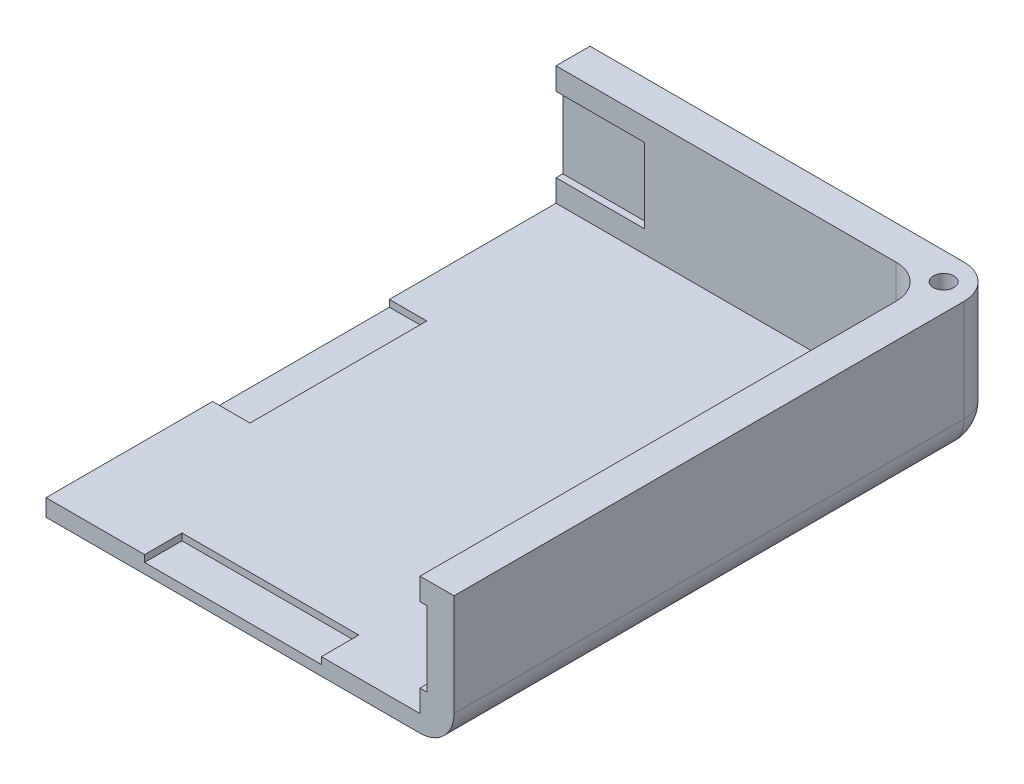
ISO-10303-21;
HEADER;
FILE_DESCRIPTION(('STEP AP214'),'2;1');
FILE_NAME('part.step','',(''),(''),'','','');
FILE_SCHEMA(('AUTOMOTIVE_DESIGN { 1 0 10303 214 1 1 1 1 }'));
ENDSEC;
DATA;
#1=APPLICATION_CONTEXT('core data for automotive mechanical design processes');
#2=APPLICATION_PROTOCOL_DEFINITION('international standard','automotive_design',2000,#1);
#3=PRODUCT_CONTEXT('',#1,'mechanical');
#4=PRODUCT('Part','Part','',(#3));
#5=PRODUCT_RELATED_PRODUCT_CATEGORY('part','',(#4));
#6=PRODUCT_DEFINITION_FORMATION('','',#4);
#7=PRODUCT_DEFINITION_CONTEXT('part definition',#1,'design');
#8=PRODUCT_DEFINITION('design','',#6,#7);
#9=PRODUCT_DEFINITION_SHAPE('','',#8);
#10=(LENGTH_UNIT() NAMED_UNIT(*) SI_UNIT(.MILLI.,.METRE.));
#11=(NAMED_UNIT(*) PLANE_ANGLE_UNIT() SI_UNIT($,.RADIAN.));
#12=(NAMED_UNIT(*) SI_UNIT($,.STERADIAN.) SOLID_ANGLE_UNIT());
#13=UNCERTAINTY_MEASURE_WITH_UNIT(LENGTH_MEASURE(1.E-05),#10,'distance_accuracy_value','');
#14=(GEOMETRIC_REPRESENTATION_CONTEXT(3) GLOBAL_UNCERTAINTY_ASSIGNED_CONTEXT((#13)) GLOBAL_UNIT_ASSIGNED_CONTEXT((#10,
#11,#12)) REPRESENTATION_CONTEXT('',''));
#15=CARTESIAN_POINT('',(0.,0.,0.));
#16=DIRECTION('',(0.,0.,1.));
#17=DIRECTION('',(1.,0.,0.));
#18=AXIS2_PLACEMENT_3D('',#15,#16,#17);
#19=CARTESIAN_POINT('',(0.,40.,0.));
#20=DIRECTION('',(1.,0.,0.));
#21=DIRECTION('',(0.,0.,-1.));
#22=AXIS2_PLACEMENT_3D('',#19,#20,#21);
#23=PLANE('',#22);
#24=DIRECTION('',(0.,-1.,0.));
#25=VECTOR('',#24,1.);
#26=CARTESIAN_POINT('',(0.,33.5,-152.));
#27=LINE('',#26,#25);
#28=CARTESIAN_POINT('',(0.,33.5,-152.));
#29=VERTEX_POINT('',#28);
#30=CARTESIAN_POINT('',(0.,11.5,-152.));
#31=VERTEX_POINT('',#30);
#32=EDGE_CURVE('E239',#29,#31,#27,.T.);
#33=ORIENTED_EDGE('',*,*,#32,.F.);
#34=DIRECTION('',(0.,0.,1.));
#35=VECTOR('',#34,1.);
#36=CARTESIAN_POINT('',(0.,33.5,-152.));
#37=LINE('',#36,#35);
#38=CARTESIAN_POINT('',(0.,33.5,-150.));
#39=VERTEX_POINT('',#38);
#40=EDGE_CURVE('E259',#29,#39,#37,.T.);
#41=ORIENTED_EDGE('',*,*,#40,.T.);
#42=DIRECTION('',(0.,1.,0.));
#43=VECTOR('',#42,1.);
#44=CARTESIAN_POINT('',(0.,5.,-150.));
#45=LINE('',#44,#43);
#46=CARTESIAN_POINT('',(0.,40.,-150.));
#47=VERTEX_POINT('',#46);
#48=EDGE_CURVE('E357',#39,#47,#45,.T.);
#49=ORIENTED_EDGE('',*,*,#48,.T.);
#50=DIRECTION('',(0.,0.,1.));
#51=VECTOR('',#50,1.);
#52=CARTESIAN_POINT('',(0.,40.,0.));
#53=LINE('',#52,#51);
#54=CARTESIAN_POINT('',(0.,40.,-160.));
#55=VERTEX_POINT('',#54);
#56=EDGE_CURVE('E361',#55,#47,#53,.T.);
#57=ORIENTED_EDGE('',*,*,#56,.F.);
#58=DIRECTION('',(0.,-1.,0.));
#59=VECTOR('',#58,1.);
#60=CARTESIAN_POINT('',(0.,40.,-160.));
#61=LINE('',#60,#59);
#62=CARTESIAN_POINT('',(0.,10.,-160.));
#63=VERTEX_POINT('',#62);
#64=EDGE_CURVE('E372',#55,#63,#61,.T.);
#65=ORIENTED_EDGE('',*,*,#64,.T.);
#66=CARTESIAN_POINT('',(0.,10.,-150.));
#67=DIRECTION('',(1.,0.,0.));
#68=DIRECTION('',(0.,0.,-1.));
#69=AXIS2_PLACEMENT_3D('',#66,#67,#68);
#70=CIRCLE('',#69,10.);
#71=CARTESIAN_POINT('',(0.,0.,-150.));
#72=VERTEX_POINT('',#71);
#73=EDGE_CURVE('E388',#63,#72,#70,.F.);
#74=ORIENTED_EDGE('',*,*,#73,.T.);
#75=DIRECTION('',(0.,0.,1.));
#76=VECTOR('',#75,1.);
#77=CARTESIAN_POINT('',(0.,0.,0.));
#78=LINE('',#77,#76);
#79=CARTESIAN_POINT('',(0.,0.,0.));
#80=VERTEX_POINT('',#79);
#81=EDGE_CURVE('E373',#72,#80,#78,.T.);
#82=ORIENTED_EDGE('',*,*,#81,.T.);
#83=DIRECTION('',(0.,-1.,0.));
#84=VECTOR('',#83,1.);
#85=CARTESIAN_POINT('',(0.,40.,0.));
#86=LINE('',#85,#84);
#87=CARTESIAN_POINT('',(0.,5.,0.));
#88=VERTEX_POINT('',#87);
#89=EDGE_CURVE('E384',#88,#80,#86,.T.);
#90=ORIENTED_EDGE('',*,*,#89,.F.);
#91=DIRECTION('',(0.,0.,1.));
#92=VECTOR('',#91,1.);
#93=CARTESIAN_POINT('',(0.,5.,0.));
#94=LINE('',#93,#92);
#95=CARTESIAN_POINT('',(0.,5.,-49.));
#96=VERTEX_POINT('',#95);
#97=EDGE_CURVE('E339',#96,#88,#94,.T.);
#98=ORIENTED_EDGE('',*,*,#97,.F.);
#99=DIRECTION('',(0.,1.,0.));
#100=VECTOR('',#99,1.);
#101=CARTESIAN_POINT('',(0.,3.,-49.));
#102=LINE('',#101,#100);
#103=CARTESIAN_POINT('',(0.,3.,-49.));
#104=VERTEX_POINT('',#103);
#105=EDGE_CURVE('E310',#104,#96,#102,.T.);
#106=ORIENTED_EDGE('',*,*,#105,.F.);
#107=DIRECTION('',(0.,0.,1.));
#108=VECTOR('',#107,1.);
#109=CARTESIAN_POINT('',(0.,3.,-101.));
#110=LINE('',#109,#108);
#111=CARTESIAN_POINT('',(0.,3.,-101.));
#112=VERTEX_POINT('',#111);
#113=EDGE_CURVE('E297',#112,#104,#110,.T.);
#114=ORIENTED_EDGE('',*,*,#113,.F.);
#115=DIRECTION('',(0.,1.,0.));
#116=VECTOR('',#115,1.);
#117=CARTESIAN_POINT('',(0.,3.,-101.));
#118=LINE('',#117,#116);
#119=CARTESIAN_POINT('',(0.,5.,-101.));
#120=VERTEX_POINT('',#119);
#121=EDGE_CURVE('E317',#112,#120,#118,.T.);
#122=ORIENTED_EDGE('',*,*,#121,.T.);
#123=CARTESIAN_POINT('',(0.,5.,-150.));
#124=VERTEX_POINT('',#123);
#125=EDGE_CURVE('E335',#124,#120,#94,.T.);
#126=ORIENTED_EDGE('',*,*,#125,.F.);
#127=CARTESIAN_POINT('',(0.,11.5,-150.));
#128=VERTEX_POINT('',#127);
#129=EDGE_CURVE('E353',#124,#128,#45,.T.);
#130=ORIENTED_EDGE('',*,*,#129,.T.);
#131=DIRECTION('',(0.,0.,1.));
#132=VECTOR('',#131,1.);
#133=CARTESIAN_POINT('',(0.,11.5,-152.));
#134=LINE('',#133,#132);
#135=EDGE_CURVE('E58',#31,#128,#134,.T.);
#136=ORIENTED_EDGE('',*,*,#135,.F.);
#137=EDGE_LOOP('',(#33,#41,#49,#57,#65,#74,#82,#90,#98,#106,#114,#122,#126,#130,#136));
#138=FACE_BOUND('',#137,.T.);
#139=ADVANCED_FACE('F35',(#138),#23,.F.);
#140=CARTESIAN_POINT('',(0.,40.,0.));
#141=DIRECTION('',(0.,0.,-1.));
#142=DIRECTION('',(-1.,0.,0.));
#143=AXIS2_PLACEMENT_3D('',#140,#141,#142);
#144=PLANE('',#143);
#145=DIRECTION('',(0.,1.,0.));
#146=VECTOR('',#145,1.);
#147=CARTESIAN_POINT('',(112.,33.5,0.));
#148=LINE('',#147,#146);
#149=CARTESIAN_POINT('',(112.,11.5,0.));
#150=VERTEX_POINT('',#149);
#151=CARTESIAN_POINT('',(112.,33.5,0.));
#152=VERTEX_POINT('',#151);
#153=EDGE_CURVE('E218',#150,#152,#148,.T.);
#154=ORIENTED_EDGE('',*,*,#153,.F.);
#155=DIRECTION('',(-1.,0.,0.));
#156=VECTOR('',#155,1.);
#157=CARTESIAN_POINT('',(112.,11.5,0.));
#158=LINE('',#157,#156);
#159=CARTESIAN_POINT('',(110.,11.5,0.));
#160=VERTEX_POINT('',#159);
#161=EDGE_CURVE('E255',#150,#160,#158,.T.);
#162=ORIENTED_EDGE('',*,*,#161,.T.);
#163=DIRECTION('',(0.,1.,0.));
#164=VECTOR('',#163,1.);
#165=CARTESIAN_POINT('',(110.,5.,0.));
#166=LINE('',#165,#164);
#167=CARTESIAN_POINT('',(110.,5.,0.));
#168=VERTEX_POINT('',#167);
#169=EDGE_CURVE('E358',#168,#160,#166,.T.);
#170=ORIENTED_EDGE('',*,*,#169,.F.);
#171=DIRECTION('',(1.,0.,0.));
#172=VECTOR('',#171,1.);
#173=CARTESIAN_POINT('',(0.,5.,0.));
#174=LINE('',#173,#172);
#175=CARTESIAN_POINT('',(81.,5.,0.));
#176=VERTEX_POINT('',#175);
#177=EDGE_CURVE('E338',#176,#168,#174,.T.);
#178=ORIENTED_EDGE('',*,*,#177,.F.);
#179=DIRECTION('',(0.,1.,0.));
#180=VECTOR('',#179,1.);
#181=CARTESIAN_POINT('',(81.,3.,0.));
#182=LINE('',#181,#180);
#183=CARTESIAN_POINT('',(81.,3.,0.));
#184=VERTEX_POINT('',#183);
#185=EDGE_CURVE('E287',#184,#176,#182,.T.);
#186=ORIENTED_EDGE('',*,*,#185,.F.);
#187=DIRECTION('',(1.,0.,0.));
#188=VECTOR('',#187,1.);
#189=CARTESIAN_POINT('',(81.,3.,0.));
#190=LINE('',#189,#188);
#191=CARTESIAN_POINT('',(29.,3.,0.));
#192=VERTEX_POINT('',#191);
#193=EDGE_CURVE('E278',#192,#184,#190,.T.);
#194=ORIENTED_EDGE('',*,*,#193,.F.);
#195=DIRECTION('',(0.,1.,0.));
#196=VECTOR('',#195,1.);
#197=CARTESIAN_POINT('',(29.,3.,0.));
#198=LINE('',#197,#196);
#199=CARTESIAN_POINT('',(29.,5.,0.));
#200=VERTEX_POINT('',#199);
#201=EDGE_CURVE('E290',#192,#200,#198,.T.);
#202=ORIENTED_EDGE('',*,*,#201,.T.);
#203=EDGE_CURVE('E340',#88,#200,#174,.T.);
#204=ORIENTED_EDGE('',*,*,#203,.F.);
#205=ORIENTED_EDGE('',*,*,#89,.T.);
#206=DIRECTION('',(1.,0.,0.));
#207=VECTOR('',#206,1.);
#208=CARTESIAN_POINT('',(0.,0.,0.));
#209=LINE('',#208,#207);
#210=CARTESIAN_POINT('',(110.,0.,0.));
#211=VERTEX_POINT('',#210);
#212=EDGE_CURVE('E365',#80,#211,#209,.T.);
#213=ORIENTED_EDGE('',*,*,#212,.T.);
#214=CARTESIAN_POINT('',(110.,10.,0.));
#215=DIRECTION('',(0.,0.,-1.));
#216=DIRECTION('',(-1.,0.,0.));
#217=AXIS2_PLACEMENT_3D('',#214,#215,#216);
#218=CIRCLE('',#217,10.);
#219=CARTESIAN_POINT('',(120.,10.,0.));
#220=VERTEX_POINT('',#219);
#221=EDGE_CURVE('E406',#211,#220,#218,.F.);
#222=ORIENTED_EDGE('',*,*,#221,.T.);
#223=DIRECTION('',(0.,-1.,0.));
#224=VECTOR('',#223,1.);
#225=CARTESIAN_POINT('',(120.,40.,0.));
#226=LINE('',#225,#224);
#227=CARTESIAN_POINT('',(120.,40.,0.));
#228=VERTEX_POINT('',#227);
#229=EDGE_CURVE('E381',#228,#220,#226,.T.);
#230=ORIENTED_EDGE('',*,*,#229,.F.);
#231=DIRECTION('',(1.,0.,0.));
#232=VECTOR('',#231,1.);
#233=CARTESIAN_POINT('',(0.,40.,0.));
#234=LINE('',#233,#232);
#235=CARTESIAN_POINT('',(110.,40.,0.));
#236=VERTEX_POINT('',#235);
#237=EDGE_CURVE('E364',#236,#228,#234,.T.);
#238=ORIENTED_EDGE('',*,*,#237,.F.);
#239=CARTESIAN_POINT('',(110.,33.5,0.));
#240=VERTEX_POINT('',#239);
#241=EDGE_CURVE('E232',#240,#236,#166,.T.);
#242=ORIENTED_EDGE('',*,*,#241,.F.);
#243=DIRECTION('',(-1.,0.,0.));
#244=VECTOR('',#243,1.);
#245=CARTESIAN_POINT('',(112.,33.5,0.));
#246=LINE('',#245,#244);
#247=EDGE_CURVE('E50',#152,#240,#246,.T.);
#248=ORIENTED_EDGE('',*,*,#247,.F.);
#249=EDGE_LOOP('',(#154,#162,#170,#178,#186,#194,#202,#204,#205,#213,#222,#230,#238,#242,#248));
#250=FACE_BOUND('',#249,.T.);
#251=ADVANCED_FACE('F230',(#250),#144,.F.);
#252=CARTESIAN_POINT('',(120.,40.,0.));
#253=DIRECTION('',(-1.,0.,0.));
#254=DIRECTION('',(0.,0.,1.));
#255=AXIS2_PLACEMENT_3D('',#252,#253,#254);
#256=PLANE('',#255);
#257=DIRECTION('',(0.,0.,-1.));
#258=VECTOR('',#257,1.);
#259=CARTESIAN_POINT('',(120.,10.,-150.));
#260=LINE('',#259,#258);
#261=CARTESIAN_POINT('',(120.,10.,-150.));
#262=VERTEX_POINT('',#261);
#263=EDGE_CURVE('E396',#220,#262,#260,.T.);
#264=ORIENTED_EDGE('',*,*,#263,.T.);
#265=DIRECTION('',(0.,-1.,0.));
#266=VECTOR('',#265,1.);
#267=CARTESIAN_POINT('',(120.,40.,-150.));
#268=LINE('',#267,#266);
#269=CARTESIAN_POINT('',(120.,40.,-150.));
#270=VERTEX_POINT('',#269);
#271=EDGE_CURVE('E398',#262,#270,#268,.F.);
#272=ORIENTED_EDGE('',*,*,#271,.T.);
#273=DIRECTION('',(0.,0.,-1.));
#274=VECTOR('',#273,1.);
#275=CARTESIAN_POINT('',(120.,40.,0.));
#276=LINE('',#275,#274);
#277=EDGE_CURVE('E367',#228,#270,#276,.T.);
#278=ORIENTED_EDGE('',*,*,#277,.F.);
#279=ORIENTED_EDGE('',*,*,#229,.T.);
#280=EDGE_LOOP('',(#264,#272,#278,#279));
#281=FACE_BOUND('',#280,.T.);
#282=ADVANCED_FACE('F486',(#281),#256,.F.);
#283=CARTESIAN_POINT('',(0.,40.,-160.));
#284=DIRECTION('',(0.,0.,1.));
#285=DIRECTION('',(1.,0.,0.));
#286=AXIS2_PLACEMENT_3D('',#283,#284,#285);
#287=PLANE('',#286);
#288=DIRECTION('',(-1.,0.,0.));
#289=VECTOR('',#288,1.);
#290=CARTESIAN_POINT('',(0.,40.,-160.));
#291=LINE('',#290,#289);
#292=CARTESIAN_POINT('',(110.,40.,-160.));
#293=VERTEX_POINT('',#292);
#294=EDGE_CURVE('E370',#293,#55,#291,.T.);
#295=ORIENTED_EDGE('',*,*,#294,.F.);
#296=DIRECTION('',(0.,-1.,0.));
#297=VECTOR('',#296,1.);
#298=CARTESIAN_POINT('',(110.,40.,-160.));
#299=LINE('',#298,#297);
#300=CARTESIAN_POINT('',(110.,10.,-160.));
#301=VERTEX_POINT('',#300);
#302=EDGE_CURVE('E393',#293,#301,#299,.T.);
#303=ORIENTED_EDGE('',*,*,#302,.T.);
#304=DIRECTION('',(-1.,0.,0.));
#305=VECTOR('',#304,1.);
#306=CARTESIAN_POINT('',(0.,10.,-160.));
#307=LINE('',#306,#305);
#308=EDGE_CURVE('E386',#301,#63,#307,.T.);
#309=ORIENTED_EDGE('',*,*,#308,.T.);
#310=ORIENTED_EDGE('',*,*,#64,.F.);
#311=EDGE_LOOP('',(#295,#303,#309,#310));
#312=FACE_BOUND('',#311,.T.);
#313=ADVANCED_FACE('F497',(#312),#287,.F.);
#314=CARTESIAN_POINT('',(0.,40.,0.));
#315=DIRECTION('',(0.,-1.,0.));
#316=DIRECTION('',(0.,0.,-1.));
#317=AXIS2_PLACEMENT_3D('',#314,#315,#316);
#318=PLANE('',#317);
#319=CARTESIAN_POINT('',(112.,40.,-152.));
#320=DIRECTION('',(0.,1.,0.));
#321=DIRECTION('',(0.,0.,1.));
#322=AXIS2_PLACEMENT_3D('',#319,#320,#321);
#323=CIRCLE('',#322,3.00000000000001);
#324=CARTESIAN_POINT('',(112.,40.,-149.));
#325=VERTEX_POINT('',#324);
#326=EDGE_CURVE('E328',#325,#325,#323,.T.);
#327=ORIENTED_EDGE('',*,*,#326,.F.);
#328=EDGE_LOOP('',(#327));
#329=FACE_BOUND('',#328,.T.);
#330=ORIENTED_EDGE('',*,*,#56,.T.);
#331=DIRECTION('',(-1.,0.,0.));
#332=VECTOR('',#331,1.);
#333=CARTESIAN_POINT('',(0.,40.,-150.));
#334=LINE('',#333,#332);
#335=CARTESIAN_POINT('',(100.,40.,-150.));
#336=VERTEX_POINT('',#335);
#337=EDGE_CURVE('E350',#336,#47,#334,.T.);
#338=ORIENTED_EDGE('',*,*,#337,.F.);
#339=CARTESIAN_POINT('',(100.,40.,-140.));
#340=DIRECTION('',(0.,-1.,0.));
#341=DIRECTION('',(0.,0.,-1.));
#342=AXIS2_PLACEMENT_3D('',#339,#340,#341);
#343=CIRCLE('',#342,10.);
#344=CARTESIAN_POINT('',(110.,40.,-140.));
#345=VERTEX_POINT('',#344);
#346=EDGE_CURVE('E11',#336,#345,#343,.T.);
#347=ORIENTED_EDGE('',*,*,#346,.T.);
#348=DIRECTION('',(0.,0.,-1.));
#349=VECTOR('',#348,1.);
#350=CARTESIAN_POINT('',(110.,40.,0.));
#351=LINE('',#350,#349);
#352=EDGE_CURVE('E332',#236,#345,#351,.T.);
#353=ORIENTED_EDGE('',*,*,#352,.F.);
#354=ORIENTED_EDGE('',*,*,#237,.T.);
#355=ORIENTED_EDGE('',*,*,#277,.T.);
#356=CARTESIAN_POINT('',(110.,40.,-150.));
#357=DIRECTION('',(0.,-1.,0.));
#358=DIRECTION('',(0.,0.,-1.));
#359=AXIS2_PLACEMENT_3D('',#356,#357,#358);
#360=CIRCLE('',#359,10.);
#361=EDGE_CURVE('E400',#270,#293,#360,.F.);
#362=ORIENTED_EDGE('',*,*,#361,.T.);
#363=ORIENTED_EDGE('',*,*,#294,.T.);
#364=EDGE_LOOP('',(#330,#338,#347,#353,#354,#355,#362,#363));
#365=FACE_BOUND('',#364,.T.);
#366=ADVANCED_FACE('F433',(#329,#365),#318,.F.);
#367=CARTESIAN_POINT('',(0.,0.,0.));
#368=DIRECTION('',(0.,-1.,0.));
#369=DIRECTION('',(0.,0.,-1.));
#370=AXIS2_PLACEMENT_3D('',#367,#368,#369);
#371=PLANE('',#370);
#372=CARTESIAN_POINT('',(90.,0.,-130.));
#373=DIRECTION('',(0.,-1.,0.));
#374=DIRECTION('',(0.,0.,-1.));
#375=AXIS2_PLACEMENT_3D('',#372,#373,#374);
#376=CIRCLE('',#375,2.5);
#377=CARTESIAN_POINT('',(90.,0.,-132.5));
#378=VERTEX_POINT('',#377);
#379=EDGE_CURVE('E320',#378,#378,#376,.T.);
#380=ORIENTED_EDGE('',*,*,#379,.F.);
#381=EDGE_LOOP('',(#380));
#382=FACE_BOUND('',#381,.T.);
#383=DIRECTION('',(-1.,0.,0.));
#384=VECTOR('',#383,1.);
#385=CARTESIAN_POINT('',(120.,0.,-150.));
#386=LINE('',#385,#384);
#387=CARTESIAN_POINT('',(110.,0.,-150.));
#388=VERTEX_POINT('',#387);
#389=EDGE_CURVE('E390',#72,#388,#386,.F.);
#390=ORIENTED_EDGE('',*,*,#389,.T.);
#391=DIRECTION('',(0.,0.,-1.));
#392=VECTOR('',#391,1.);
#393=CARTESIAN_POINT('',(110.,0.,0.));
#394=LINE('',#393,#392);
#395=EDGE_CURVE('E404',#388,#211,#394,.F.);
#396=ORIENTED_EDGE('',*,*,#395,.T.);
#397=ORIENTED_EDGE('',*,*,#212,.F.);
#398=ORIENTED_EDGE('',*,*,#81,.F.);
#399=EDGE_LOOP('',(#390,#396,#397,#398));
#400=FACE_BOUND('',#399,.T.);
#401=ADVANCED_FACE('F544',(#382,#400),#371,.T.);
#402=CARTESIAN_POINT('',(0.,10.,-150.));
#403=DIRECTION('',(1.,0.,0.));
#404=DIRECTION('',(0.,0.,-1.));
#405=AXIS2_PLACEMENT_3D('',#402,#403,#404);
#406=CYLINDRICAL_SURFACE('',#405,10.);
#407=ORIENTED_EDGE('',*,*,#308,.F.);
#408=CARTESIAN_POINT('',(110.,10.,-150.));
#409=DIRECTION('',(1.,0.,0.));
#410=DIRECTION('',(0.,0.,-1.));
#411=AXIS2_PLACEMENT_3D('',#408,#409,#410);
#412=CIRCLE('',#411,10.);
#413=EDGE_CURVE('E402',#301,#388,#412,.F.);
#414=ORIENTED_EDGE('',*,*,#413,.T.);
#415=ORIENTED_EDGE('',*,*,#389,.F.);
#416=ORIENTED_EDGE('',*,*,#73,.F.);
#417=EDGE_LOOP('',(#407,#414,#415,#416));
#418=FACE_BOUND('',#417,.T.);
#419=ADVANCED_FACE('F501',(#418),#406,.T.);
#420=CARTESIAN_POINT('',(110.,10.,0.));
#421=DIRECTION('',(0.,0.,1.));
#422=DIRECTION('',(1.,0.,0.));
#423=AXIS2_PLACEMENT_3D('',#420,#421,#422);
#424=CYLINDRICAL_SURFACE('',#423,10.);
#425=ORIENTED_EDGE('',*,*,#221,.F.);
#426=ORIENTED_EDGE('',*,*,#395,.F.);
#427=CARTESIAN_POINT('',(110.,10.,-150.));
#428=DIRECTION('',(0.,0.,-1.));
#429=DIRECTION('',(-1.,0.,0.));
#430=AXIS2_PLACEMENT_3D('',#427,#428,#429);
#431=CIRCLE('',#430,10.);
#432=EDGE_CURVE('E376',#262,#388,#431,.T.);
#433=ORIENTED_EDGE('',*,*,#432,.F.);
#434=ORIENTED_EDGE('',*,*,#263,.F.);
#435=EDGE_LOOP('',(#425,#426,#433,#434));
#436=FACE_BOUND('',#435,.T.);
#437=ADVANCED_FACE('F482',(#436),#424,.T.);
#438=CARTESIAN_POINT('',(110.,10.,-150.));
#439=DIRECTION('',(-1.,0.,0.));
#440=DIRECTION('',(0.,0.,1.));
#441=AXIS2_PLACEMENT_3D('',#438,#439,#440);
#442=SPHERICAL_SURFACE('',#441,10.);
#443=ORIENTED_EDGE('',*,*,#432,.T.);
#444=ORIENTED_EDGE('',*,*,#413,.F.);
#445=CARTESIAN_POINT('',(110.,10.,-150.));
#446=DIRECTION('',(0.,1.,0.));
#447=DIRECTION('',(0.,0.,1.));
#448=AXIS2_PLACEMENT_3D('',#445,#446,#447);
#449=CIRCLE('',#448,10.);
#450=EDGE_CURVE('E356',#262,#301,#449,.T.);
#451=ORIENTED_EDGE('',*,*,#450,.F.);
#452=EDGE_LOOP('',(#443,#444,#451));
#453=FACE_BOUND('',#452,.T.);
#454=ADVANCED_FACE('F547',(#453),#442,.T.);
#455=CARTESIAN_POINT('',(110.,40.,-150.));
#456=DIRECTION('',(0.,-1.,0.));
#457=DIRECTION('',(0.,0.,-1.));
#458=AXIS2_PLACEMENT_3D('',#455,#456,#457);
#459=CYLINDRICAL_SURFACE('',#458,10.);
#460=ORIENTED_EDGE('',*,*,#361,.F.);
#461=ORIENTED_EDGE('',*,*,#271,.F.);
#462=ORIENTED_EDGE('',*,*,#450,.T.);
#463=ORIENTED_EDGE('',*,*,#302,.F.);
#464=EDGE_LOOP('',(#460,#461,#462,#463));
#465=FACE_BOUND('',#464,.T.);
#466=ADVANCED_FACE('F492',(#465),#459,.T.);
#467=CARTESIAN_POINT('',(0.,5.,-150.));
#468=DIRECTION('',(0.,0.,-1.));
#469=DIRECTION('',(-1.,0.,0.));
#470=AXIS2_PLACEMENT_3D('',#467,#468,#469);
#471=PLANE('',#470);
#472=ORIENTED_EDGE('',*,*,#48,.F.);
#473=DIRECTION('',(-1.,0.,0.));
#474=VECTOR('',#473,1.);
#475=CARTESIAN_POINT('',(0.,33.5,-150.));
#476=LINE('',#475,#474);
#477=CARTESIAN_POINT('',(26.,33.5,-150.));
#478=VERTEX_POINT('',#477);
#479=EDGE_CURVE('E243',#478,#39,#476,.T.);
#480=ORIENTED_EDGE('',*,*,#479,.F.);
#481=DIRECTION('',(0.,1.,0.));
#482=VECTOR('',#481,1.);
#483=CARTESIAN_POINT('',(26.,33.5,-150.));
#484=LINE('',#483,#482);
#485=CARTESIAN_POINT('',(26.,11.5,-150.));
#486=VERTEX_POINT('',#485);
#487=EDGE_CURVE('E254',#486,#478,#484,.T.);
#488=ORIENTED_EDGE('',*,*,#487,.F.);
#489=DIRECTION('',(1.,0.,0.));
#490=VECTOR('',#489,1.);
#491=CARTESIAN_POINT('',(0.,11.5,-150.));
#492=LINE('',#491,#490);
#493=EDGE_CURVE('E252',#128,#486,#492,.T.);
#494=ORIENTED_EDGE('',*,*,#493,.F.);
#495=ORIENTED_EDGE('',*,*,#129,.F.);
#496=DIRECTION('',(-1.,0.,0.));
#497=VECTOR('',#496,1.);
#498=CARTESIAN_POINT('',(0.,5.,-150.));
#499=LINE('',#498,#497);
#500=CARTESIAN_POINT('',(100.,5.,-150.));
#501=VERTEX_POINT('',#500);
#502=EDGE_CURVE('E346',#501,#124,#499,.T.);
#503=ORIENTED_EDGE('',*,*,#502,.F.);
#504=DIRECTION('',(0.,1.,0.));
#505=VECTOR('',#504,1.);
#506=CARTESIAN_POINT('',(100.,40.,-150.));
#507=LINE('',#506,#505);
#508=EDGE_CURVE('E408',#501,#336,#507,.T.);
#509=ORIENTED_EDGE('',*,*,#508,.T.);
#510=ORIENTED_EDGE('',*,*,#337,.T.);
#511=EDGE_LOOP('',(#472,#480,#488,#494,#495,#503,#509,#510));
#512=FACE_BOUND('',#511,.T.);
#513=ADVANCED_FACE('F427',(#512),#471,.F.);
#514=CARTESIAN_POINT('',(110.,5.,0.));
#515=DIRECTION('',(1.,0.,0.));
#516=DIRECTION('',(0.,0.,-1.));
#517=AXIS2_PLACEMENT_3D('',#514,#515,#516);
#518=PLANE('',#517);
#519=ORIENTED_EDGE('',*,*,#169,.T.);
#520=DIRECTION('',(0.,0.,1.));
#521=VECTOR('',#520,1.);
#522=CARTESIAN_POINT('',(110.,11.5,0.));
#523=LINE('',#522,#521);
#524=CARTESIAN_POINT('',(110.,11.5,-26.));
#525=VERTEX_POINT('',#524);
#526=EDGE_CURVE('E227',#525,#160,#523,.T.);
#527=ORIENTED_EDGE('',*,*,#526,.F.);
#528=DIRECTION('',(0.,-1.,0.));
#529=VECTOR('',#528,1.);
#530=CARTESIAN_POINT('',(110.,33.5,-26.));
#531=LINE('',#530,#529);
#532=CARTESIAN_POINT('',(110.,33.5,-26.));
#533=VERTEX_POINT('',#532);
#534=EDGE_CURVE('E440',#533,#525,#531,.T.);
#535=ORIENTED_EDGE('',*,*,#534,.F.);
#536=DIRECTION('',(0.,0.,-1.));
#537=VECTOR('',#536,1.);
#538=CARTESIAN_POINT('',(110.,33.5,0.));
#539=LINE('',#538,#537);
#540=EDGE_CURVE('E437',#240,#533,#539,.T.);
#541=ORIENTED_EDGE('',*,*,#540,.F.);
#542=ORIENTED_EDGE('',*,*,#241,.T.);
#543=ORIENTED_EDGE('',*,*,#352,.T.);
#544=DIRECTION('',(0.,1.,0.));
#545=VECTOR('',#544,1.);
#546=CARTESIAN_POINT('',(110.,5.,-140.));
#547=LINE('',#546,#545);
#548=CARTESIAN_POINT('',(110.,5.,-140.));
#549=VERTEX_POINT('',#548);
#550=EDGE_CURVE('E414',#345,#549,#547,.F.);
#551=ORIENTED_EDGE('',*,*,#550,.T.);
#552=DIRECTION('',(0.,0.,-1.));
#553=VECTOR('',#552,1.);
#554=CARTESIAN_POINT('',(110.,5.,0.));
#555=LINE('',#554,#553);
#556=EDGE_CURVE('E343',#168,#549,#555,.T.);
#557=ORIENTED_EDGE('',*,*,#556,.F.);
#558=EDGE_LOOP('',(#519,#527,#535,#541,#542,#543,#551,#557));
#559=FACE_BOUND('',#558,.T.);
#560=ADVANCED_FACE('F435',(#559),#518,.F.);
#561=CARTESIAN_POINT('',(0.,5.,0.));
#562=DIRECTION('',(0.,-1.,0.));
#563=DIRECTION('',(0.,0.,-1.));
#564=AXIS2_PLACEMENT_3D('',#561,#562,#563);
#565=PLANE('',#564);
#566=DIRECTION('',(-1.,0.,0.));
#567=VECTOR('',#566,1.);
#568=CARTESIAN_POINT('',(81.,5.,-11.));
#569=LINE('',#568,#567);
#570=CARTESIAN_POINT('',(81.,5.,-11.));
#571=VERTEX_POINT('',#570);
#572=CARTESIAN_POINT('',(29.,5.,-11.));
#573=VERTEX_POINT('',#572);
#574=EDGE_CURVE('E283',#571,#573,#569,.T.);
#575=ORIENTED_EDGE('',*,*,#574,.F.);
#576=DIRECTION('',(0.,0.,-1.));
#577=VECTOR('',#576,1.);
#578=CARTESIAN_POINT('',(81.,5.,0.));
#579=LINE('',#578,#577);
#580=EDGE_CURVE('E262',#176,#571,#579,.T.);
#581=ORIENTED_EDGE('',*,*,#580,.F.);
#582=ORIENTED_EDGE('',*,*,#177,.T.);
#583=ORIENTED_EDGE('',*,*,#556,.T.);
#584=CARTESIAN_POINT('',(100.,5.,-140.));
#585=DIRECTION('',(0.,-1.,0.));
#586=DIRECTION('',(0.,0.,-1.));
#587=AXIS2_PLACEMENT_3D('',#584,#585,#586);
#588=CIRCLE('',#587,10.);
#589=EDGE_CURVE('E43',#549,#501,#588,.F.);
#590=ORIENTED_EDGE('',*,*,#589,.T.);
#591=ORIENTED_EDGE('',*,*,#502,.T.);
#592=ORIENTED_EDGE('',*,*,#125,.T.);
#593=DIRECTION('',(-1.,0.,0.));
#594=VECTOR('',#593,1.);
#595=CARTESIAN_POINT('',(0.,5.,-101.));
#596=LINE('',#595,#594);
#597=CARTESIAN_POINT('',(11.,5.,-101.));
#598=VERTEX_POINT('',#597);
#599=EDGE_CURVE('E301',#598,#120,#596,.T.);
#600=ORIENTED_EDGE('',*,*,#599,.F.);
#601=DIRECTION('',(0.,0.,-1.));
#602=VECTOR('',#601,1.);
#603=CARTESIAN_POINT('',(11.,5.,-101.));
#604=LINE('',#603,#602);
#605=CARTESIAN_POINT('',(11.,5.,-49.));
#606=VERTEX_POINT('',#605);
#607=EDGE_CURVE('E313',#606,#598,#604,.T.);
#608=ORIENTED_EDGE('',*,*,#607,.F.);
#609=DIRECTION('',(1.,0.,0.));
#610=VECTOR('',#609,1.);
#611=CARTESIAN_POINT('',(0.,5.,-49.));
#612=LINE('',#611,#610);
#613=EDGE_CURVE('E289',#96,#606,#612,.T.);
#614=ORIENTED_EDGE('',*,*,#613,.F.);
#615=ORIENTED_EDGE('',*,*,#97,.T.);
#616=ORIENTED_EDGE('',*,*,#203,.T.);
#617=DIRECTION('',(0.,0.,1.));
#618=VECTOR('',#617,1.);
#619=CARTESIAN_POINT('',(29.,5.,0.));
#620=LINE('',#619,#618);
#621=EDGE_CURVE('E272',#573,#200,#620,.T.);
#622=ORIENTED_EDGE('',*,*,#621,.F.);
#623=EDGE_LOOP('',(#575,#581,#582,#583,#590,#591,#592,#600,#608,#614,#615,#616,#622));
#624=FACE_BOUND('',#623,.T.);
#625=ADVANCED_FACE('F419',(#624),#565,.F.);
#626=CARTESIAN_POINT('',(100.,5.,-140.));
#627=DIRECTION('',(0.,-1.,0.));
#628=DIRECTION('',(0.,0.,-1.));
#629=AXIS2_PLACEMENT_3D('',#626,#627,#628);
#630=CYLINDRICAL_SURFACE('',#629,10.);
#631=ORIENTED_EDGE('',*,*,#589,.F.);
#632=ORIENTED_EDGE('',*,*,#550,.F.);
#633=ORIENTED_EDGE('',*,*,#346,.F.);
#634=ORIENTED_EDGE('',*,*,#508,.F.);
#635=EDGE_LOOP('',(#631,#632,#633,#634));
#636=FACE_BOUND('',#635,.T.);
#637=ADVANCED_FACE('F430',(#636),#630,.F.);
#638=CARTESIAN_POINT('',(112.,5.,-152.));
#639=DIRECTION('',(0.,1.,0.));
#640=DIRECTION('',(0.,0.,1.));
#641=AXIS2_PLACEMENT_3D('',#638,#639,#640);
#642=CYLINDRICAL_SURFACE('',#641,3.00000000000001);
#643=CARTESIAN_POINT('',(112.,5.,-152.));
#644=DIRECTION('',(0.,1.,0.));
#645=DIRECTION('',(0.,0.,1.));
#646=AXIS2_PLACEMENT_3D('',#643,#644,#645);
#647=CIRCLE('',#646,3.00000000000001);
#648=CARTESIAN_POINT('',(112.,5.,-149.));
#649=VERTEX_POINT('',#648);
#650=EDGE_CURVE('E329',#649,#649,#647,.T.);
#651=ORIENTED_EDGE('',*,*,#650,.F.);
#652=EDGE_LOOP('',(#651));
#653=FACE_BOUND('',#652,.T.);
#654=ORIENTED_EDGE('',*,*,#326,.T.);
#655=EDGE_LOOP('',(#654));
#656=FACE_BOUND('',#655,.T.);
#657=ADVANCED_FACE('F553',(#653,#656),#642,.F.);
#658=CARTESIAN_POINT('',(112.,5.,-152.));
#659=DIRECTION('',(0.,1.,0.));
#660=DIRECTION('',(0.,0.,1.));
#661=AXIS2_PLACEMENT_3D('',#658,#659,#660);
#662=PLANE('',#661);
#663=ORIENTED_EDGE('',*,*,#650,.T.);
#664=EDGE_LOOP('',(#663));
#665=FACE_BOUND('',#664,.T.);
#666=ADVANCED_FACE('F558',(#665),#662,.T.);
#667=CARTESIAN_POINT('',(90.,0.,-130.));
#668=DIRECTION('',(0.,-1.,0.));
#669=DIRECTION('',(0.,0.,-1.));
#670=AXIS2_PLACEMENT_3D('',#667,#668,#669);
#671=SPHERICAL_SURFACE('',#670,2.5);
#672=ORIENTED_EDGE('',*,*,#379,.T.);
#673=EDGE_LOOP('',(#672));
#674=FACE_BOUND('',#673,.T.);
#675=ADVANCED_FACE('F37',(#674),#671,.T.);
#676=CARTESIAN_POINT('',(0.,3.,-101.));
#677=DIRECTION('',(0.,0.,-1.));
#678=DIRECTION('',(-1.,0.,0.));
#679=AXIS2_PLACEMENT_3D('',#676,#677,#678);
#680=PLANE('',#679);
#681=ORIENTED_EDGE('',*,*,#599,.T.);
#682=ORIENTED_EDGE('',*,*,#121,.F.);
#683=DIRECTION('',(-1.,0.,0.));
#684=VECTOR('',#683,1.);
#685=CARTESIAN_POINT('',(0.,3.,-101.));
#686=LINE('',#685,#684);
#687=CARTESIAN_POINT('',(11.,3.,-101.));
#688=VERTEX_POINT('',#687);
#689=EDGE_CURVE('E307',#688,#112,#686,.T.);
#690=ORIENTED_EDGE('',*,*,#689,.F.);
#691=DIRECTION('',(0.,1.,0.));
#692=VECTOR('',#691,1.);
#693=CARTESIAN_POINT('',(11.,3.,-101.));
#694=LINE('',#693,#692);
#695=EDGE_CURVE('E321',#688,#598,#694,.T.);
#696=ORIENTED_EDGE('',*,*,#695,.T.);
#697=EDGE_LOOP('',(#681,#682,#690,#696));
#698=FACE_BOUND('',#697,.T.);
#699=ADVANCED_FACE('F515',(#698),#680,.F.);
#700=CARTESIAN_POINT('',(11.,3.,-101.));
#701=DIRECTION('',(1.,0.,0.));
#702=DIRECTION('',(0.,0.,-1.));
#703=AXIS2_PLACEMENT_3D('',#700,#701,#702);
#704=PLANE('',#703);
#705=ORIENTED_EDGE('',*,*,#607,.T.);
#706=ORIENTED_EDGE('',*,*,#695,.F.);
#707=DIRECTION('',(0.,0.,-1.));
#708=VECTOR('',#707,1.);
#709=CARTESIAN_POINT('',(11.,3.,-101.));
#710=LINE('',#709,#708);
#711=CARTESIAN_POINT('',(11.,3.,-49.));
#712=VERTEX_POINT('',#711);
#713=EDGE_CURVE('E304',#712,#688,#710,.T.);
#714=ORIENTED_EDGE('',*,*,#713,.F.);
#715=DIRECTION('',(0.,1.,0.));
#716=VECTOR('',#715,1.);
#717=CARTESIAN_POINT('',(11.,3.,-49.));
#718=LINE('',#717,#716);
#719=EDGE_CURVE('E323',#712,#606,#718,.T.);
#720=ORIENTED_EDGE('',*,*,#719,.T.);
#721=EDGE_LOOP('',(#705,#706,#714,#720));
#722=FACE_BOUND('',#721,.T.);
#723=ADVANCED_FACE('F519',(#722),#704,.F.);
#724=CARTESIAN_POINT('',(0.,3.,-49.));
#725=DIRECTION('',(0.,0.,1.));
#726=DIRECTION('',(1.,0.,0.));
#727=AXIS2_PLACEMENT_3D('',#724,#725,#726);
#728=PLANE('',#727);
#729=ORIENTED_EDGE('',*,*,#613,.T.);
#730=ORIENTED_EDGE('',*,*,#719,.F.);
#731=DIRECTION('',(1.,0.,0.));
#732=VECTOR('',#731,1.);
#733=CARTESIAN_POINT('',(0.,3.,-49.));
#734=LINE('',#733,#732);
#735=EDGE_CURVE('E300',#104,#712,#734,.T.);
#736=ORIENTED_EDGE('',*,*,#735,.F.);
#737=ORIENTED_EDGE('',*,*,#105,.T.);
#738=EDGE_LOOP('',(#729,#730,#736,#737));
#739=FACE_BOUND('',#738,.T.);
#740=ADVANCED_FACE('F521',(#739),#728,.F.);
#741=CARTESIAN_POINT('',(0.,3.,0.));
#742=DIRECTION('',(0.,1.,0.));
#743=DIRECTION('',(0.,0.,1.));
#744=AXIS2_PLACEMENT_3D('',#741,#742,#743);
#745=PLANE('',#744);
#746=ORIENTED_EDGE('',*,*,#113,.T.);
#747=ORIENTED_EDGE('',*,*,#735,.T.);
#748=ORIENTED_EDGE('',*,*,#713,.T.);
#749=ORIENTED_EDGE('',*,*,#689,.T.);
#750=EDGE_LOOP('',(#746,#747,#748,#749));
#751=FACE_BOUND('',#750,.T.);
#752=ADVANCED_FACE('F523',(#751),#745,.T.);
#753=CARTESIAN_POINT('',(81.,3.,0.));
#754=DIRECTION('',(1.,0.,0.));
#755=DIRECTION('',(0.,0.,-1.));
#756=AXIS2_PLACEMENT_3D('',#753,#754,#755);
#757=PLANE('',#756);
#758=ORIENTED_EDGE('',*,*,#580,.T.);
#759=DIRECTION('',(0.,1.,0.));
#760=VECTOR('',#759,1.);
#761=CARTESIAN_POINT('',(81.,3.,-11.));
#762=LINE('',#761,#760);
#763=CARTESIAN_POINT('',(81.,3.,-11.));
#764=VERTEX_POINT('',#763);
#765=EDGE_CURVE('E281',#764,#571,#762,.T.);
#766=ORIENTED_EDGE('',*,*,#765,.F.);
#767=DIRECTION('',(0.,0.,-1.));
#768=VECTOR('',#767,1.);
#769=CARTESIAN_POINT('',(81.,3.,0.));
#770=LINE('',#769,#768);
#771=EDGE_CURVE('E268',#184,#764,#770,.T.);
#772=ORIENTED_EDGE('',*,*,#771,.F.);
#773=ORIENTED_EDGE('',*,*,#185,.T.);
#774=EDGE_LOOP('',(#758,#766,#772,#773));
#775=FACE_BOUND('',#774,.T.);
#776=ADVANCED_FACE('F457',(#775),#757,.F.);
#777=CARTESIAN_POINT('',(29.,3.,0.));
#778=DIRECTION('',(-1.,0.,0.));
#779=DIRECTION('',(0.,0.,1.));
#780=AXIS2_PLACEMENT_3D('',#777,#778,#779);
#781=PLANE('',#780);
#782=ORIENTED_EDGE('',*,*,#621,.T.);
#783=ORIENTED_EDGE('',*,*,#201,.F.);
#784=DIRECTION('',(0.,0.,1.));
#785=VECTOR('',#784,1.);
#786=CARTESIAN_POINT('',(29.,3.,0.));
#787=LINE('',#786,#785);
#788=CARTESIAN_POINT('',(29.,3.,-11.));
#789=VERTEX_POINT('',#788);
#790=EDGE_CURVE('E275',#789,#192,#787,.T.);
#791=ORIENTED_EDGE('',*,*,#790,.F.);
#792=DIRECTION('',(0.,1.,0.));
#793=VECTOR('',#792,1.);
#794=CARTESIAN_POINT('',(29.,3.,-11.));
#795=LINE('',#794,#793);
#796=EDGE_CURVE('E293',#789,#573,#795,.T.);
#797=ORIENTED_EDGE('',*,*,#796,.T.);
#798=EDGE_LOOP('',(#782,#783,#791,#797));
#799=FACE_BOUND('',#798,.T.);
#800=ADVANCED_FACE('F530',(#799),#781,.F.);
#801=CARTESIAN_POINT('',(81.,3.,-11.));
#802=DIRECTION('',(0.,0.,-1.));
#803=DIRECTION('',(-1.,0.,0.));
#804=AXIS2_PLACEMENT_3D('',#801,#802,#803);
#805=PLANE('',#804);
#806=ORIENTED_EDGE('',*,*,#574,.T.);
#807=ORIENTED_EDGE('',*,*,#796,.F.);
#808=DIRECTION('',(-1.,0.,0.));
#809=VECTOR('',#808,1.);
#810=CARTESIAN_POINT('',(81.,3.,-11.));
#811=LINE('',#810,#809);
#812=EDGE_CURVE('E271',#764,#789,#811,.T.);
#813=ORIENTED_EDGE('',*,*,#812,.F.);
#814=ORIENTED_EDGE('',*,*,#765,.T.);
#815=EDGE_LOOP('',(#806,#807,#813,#814));
#816=FACE_BOUND('',#815,.T.);
#817=ADVANCED_FACE('F460',(#816),#805,.F.);
#818=CARTESIAN_POINT('',(0.,3.,0.));
#819=DIRECTION('',(0.,1.,0.));
#820=DIRECTION('',(0.,0.,1.));
#821=AXIS2_PLACEMENT_3D('',#818,#819,#820);
#822=PLANE('',#821);
#823=ORIENTED_EDGE('',*,*,#771,.T.);
#824=ORIENTED_EDGE('',*,*,#812,.T.);
#825=ORIENTED_EDGE('',*,*,#790,.T.);
#826=ORIENTED_EDGE('',*,*,#193,.T.);
#827=EDGE_LOOP('',(#823,#824,#825,#826));
#828=FACE_BOUND('',#827,.T.);
#829=ADVANCED_FACE('F463',(#828),#822,.T.);
#830=CARTESIAN_POINT('',(0.,33.5,-152.));
#831=DIRECTION('',(0.,1.,0.));
#832=DIRECTION('',(0.,0.,1.));
#833=AXIS2_PLACEMENT_3D('',#830,#831,#832);
#834=PLANE('',#833);
#835=ORIENTED_EDGE('',*,*,#479,.T.);
#836=ORIENTED_EDGE('',*,*,#40,.F.);
#837=DIRECTION('',(-1.,0.,0.));
#838=VECTOR('',#837,1.);
#839=CARTESIAN_POINT('',(0.,33.5,-152.));
#840=LINE('',#839,#838);
#841=CARTESIAN_POINT('',(26.,33.5,-152.));
#842=VERTEX_POINT('',#841);
#843=EDGE_CURVE('E249',#842,#29,#840,.T.);
#844=ORIENTED_EDGE('',*,*,#843,.F.);
#845=DIRECTION('',(0.,0.,1.));
#846=VECTOR('',#845,1.);
#847=CARTESIAN_POINT('',(26.,33.5,-152.));
#848=LINE('',#847,#846);
#849=EDGE_CURVE('E263',#842,#478,#848,.T.);
#850=ORIENTED_EDGE('',*,*,#849,.T.);
#851=EDGE_LOOP('',(#835,#836,#844,#850));
#852=FACE_BOUND('',#851,.T.);
#853=ADVANCED_FACE('F507',(#852),#834,.F.);
#854=CARTESIAN_POINT('',(26.,33.5,-152.));
#855=DIRECTION('',(1.,0.,0.));
#856=DIRECTION('',(0.,1.,0.));
#857=AXIS2_PLACEMENT_3D('',#854,#855,#856);
#858=PLANE('',#857);
#859=ORIENTED_EDGE('',*,*,#487,.T.);
#860=ORIENTED_EDGE('',*,*,#849,.F.);
#861=DIRECTION('',(0.,1.,0.));
#862=VECTOR('',#861,1.);
#863=CARTESIAN_POINT('',(26.,33.5,-152.));
#864=LINE('',#863,#862);
#865=CARTESIAN_POINT('',(26.,11.5,-152.));
#866=VERTEX_POINT('',#865);
#867=EDGE_CURVE('E246',#866,#842,#864,.T.);
#868=ORIENTED_EDGE('',*,*,#867,.F.);
#869=DIRECTION('',(0.,0.,1.));
#870=VECTOR('',#869,1.);
#871=CARTESIAN_POINT('',(26.,11.5,-152.));
#872=LINE('',#871,#870);
#873=EDGE_CURVE('E265',#866,#486,#872,.T.);
#874=ORIENTED_EDGE('',*,*,#873,.T.);
#875=EDGE_LOOP('',(#859,#860,#868,#874));
#876=FACE_BOUND('',#875,.T.);
#877=ADVANCED_FACE('F511',(#876),#858,.F.);
#878=CARTESIAN_POINT('',(0.,11.5,-152.));
#879=DIRECTION('',(0.,-1.,0.));
#880=DIRECTION('',(0.,0.,-1.));
#881=AXIS2_PLACEMENT_3D('',#878,#879,#880);
#882=PLANE('',#881);
#883=ORIENTED_EDGE('',*,*,#493,.T.);
#884=ORIENTED_EDGE('',*,*,#873,.F.);
#885=DIRECTION('',(1.,0.,0.));
#886=VECTOR('',#885,1.);
#887=CARTESIAN_POINT('',(0.,11.5,-152.));
#888=LINE('',#887,#886);
#889=EDGE_CURVE('E242',#31,#866,#888,.T.);
#890=ORIENTED_EDGE('',*,*,#889,.F.);
#891=ORIENTED_EDGE('',*,*,#135,.T.);
#892=EDGE_LOOP('',(#883,#884,#890,#891));
#893=FACE_BOUND('',#892,.T.);
#894=ADVANCED_FACE('F512',(#893),#882,.F.);
#895=CARTESIAN_POINT('',(0.,0.,-152.));
#896=DIRECTION('',(0.,0.,1.));
#897=DIRECTION('',(1.,0.,0.));
#898=AXIS2_PLACEMENT_3D('',#895,#896,#897);
#899=PLANE('',#898);
#900=ORIENTED_EDGE('',*,*,#32,.T.);
#901=ORIENTED_EDGE('',*,*,#889,.T.);
#902=ORIENTED_EDGE('',*,*,#867,.T.);
#903=ORIENTED_EDGE('',*,*,#843,.T.);
#904=EDGE_LOOP('',(#900,#901,#902,#903));
#905=FACE_BOUND('',#904,.T.);
#906=ADVANCED_FACE('F635',(#905),#899,.T.);
#907=CARTESIAN_POINT('',(112.,11.5,0.));
#908=DIRECTION('',(0.,-1.,0.));
#909=DIRECTION('',(0.,0.,-1.));
#910=AXIS2_PLACEMENT_3D('',#907,#908,#909);
#911=PLANE('',#910);
#912=ORIENTED_EDGE('',*,*,#526,.T.);
#913=ORIENTED_EDGE('',*,*,#161,.F.);
#914=DIRECTION('',(0.,0.,1.));
#915=VECTOR('',#914,1.);
#916=CARTESIAN_POINT('',(112.,11.5,0.));
#917=LINE('',#916,#915);
#918=CARTESIAN_POINT('',(112.,11.5,-26.));
#919=VERTEX_POINT('',#918);
#920=EDGE_CURVE('E224',#919,#150,#917,.T.);
#921=ORIENTED_EDGE('',*,*,#920,.F.);
#922=DIRECTION('',(-1.,0.,0.));
#923=VECTOR('',#922,1.);
#924=CARTESIAN_POINT('',(112.,11.5,-26.));
#925=LINE('',#924,#923);
#926=EDGE_CURVE('E234',#919,#525,#925,.T.);
#927=ORIENTED_EDGE('',*,*,#926,.T.);
#928=EDGE_LOOP('',(#912,#913,#921,#927));
#929=FACE_BOUND('',#928,.T.);
#930=ADVANCED_FACE('F447',(#929),#911,.F.);
#931=CARTESIAN_POINT('',(112.,33.5,-26.));
#932=DIRECTION('',(0.,0.,-1.));
#933=DIRECTION('',(0.,1.,0.));
#934=AXIS2_PLACEMENT_3D('',#931,#932,#933);
#935=PLANE('',#934);
#936=ORIENTED_EDGE('',*,*,#534,.T.);
#937=ORIENTED_EDGE('',*,*,#926,.F.);
#938=DIRECTION('',(0.,-1.,0.));
#939=VECTOR('',#938,1.);
#940=CARTESIAN_POINT('',(112.,33.5,-26.));
#941=LINE('',#940,#939);
#942=CARTESIAN_POINT('',(112.,33.5,-26.));
#943=VERTEX_POINT('',#942);
#944=EDGE_CURVE('E217',#943,#919,#941,.T.);
#945=ORIENTED_EDGE('',*,*,#944,.F.);
#946=DIRECTION('',(-1.,0.,0.));
#947=VECTOR('',#946,1.);
#948=CARTESIAN_POINT('',(112.,33.5,-26.));
#949=LINE('',#948,#947);
#950=EDGE_CURVE('E213',#943,#533,#949,.T.);
#951=ORIENTED_EDGE('',*,*,#950,.T.);
#952=EDGE_LOOP('',(#936,#937,#945,#951));
#953=FACE_BOUND('',#952,.T.);
#954=ADVANCED_FACE('F449',(#953),#935,.F.);
#955=CARTESIAN_POINT('',(112.,33.5,0.));
#956=DIRECTION('',(0.,1.,0.));
#957=DIRECTION('',(0.,0.,1.));
#958=AXIS2_PLACEMENT_3D('',#955,#956,#957);
#959=PLANE('',#958);
#960=ORIENTED_EDGE('',*,*,#540,.T.);
#961=ORIENTED_EDGE('',*,*,#950,.F.);
#962=DIRECTION('',(0.,0.,-1.));
#963=VECTOR('',#962,1.);
#964=CARTESIAN_POINT('',(112.,33.5,0.));
#965=LINE('',#964,#963);
#966=EDGE_CURVE('E210',#152,#943,#965,.T.);
#967=ORIENTED_EDGE('',*,*,#966,.F.);
#968=ORIENTED_EDGE('',*,*,#247,.T.);
#969=EDGE_LOOP('',(#960,#961,#967,#968));
#970=FACE_BOUND('',#969,.T.);
#971=ADVANCED_FACE('F212',(#970),#959,.F.);
#972=CARTESIAN_POINT('',(112.,0.,0.));
#973=DIRECTION('',(1.,0.,0.));
#974=DIRECTION('',(0.,0.,-1.));
#975=AXIS2_PLACEMENT_3D('',#972,#973,#974);
#976=PLANE('',#975);
#977=ORIENTED_EDGE('',*,*,#153,.T.);
#978=ORIENTED_EDGE('',*,*,#966,.T.);
#979=ORIENTED_EDGE('',*,*,#944,.T.);
#980=ORIENTED_EDGE('',*,*,#920,.T.);
#981=EDGE_LOOP('',(#977,#978,#979,#980));
#982=FACE_BOUND('',#981,.T.);
#983=ADVANCED_FACE('F222',(#982),#976,.F.);
#984=CLOSED_SHELL('',(#139,#251,#282,#313,#366,#401,#419,#437,#454,#466,#513,#560,#625,#637,
#657,#666,#675,#699,#723,#740,#752,#776,#800,#817,#829,#853,#877,#894,#906,#930,#954,#971,#983));
#985=MANIFOLD_SOLID_BREP('B2',#984);
#986=ADVANCED_BREP_SHAPE_REPRESENTATION('',(#18,#985),#14);
#987=SHAPE_DEFINITION_REPRESENTATION(#9,#986);
ENDSEC;
END-ISO-10303-21;
